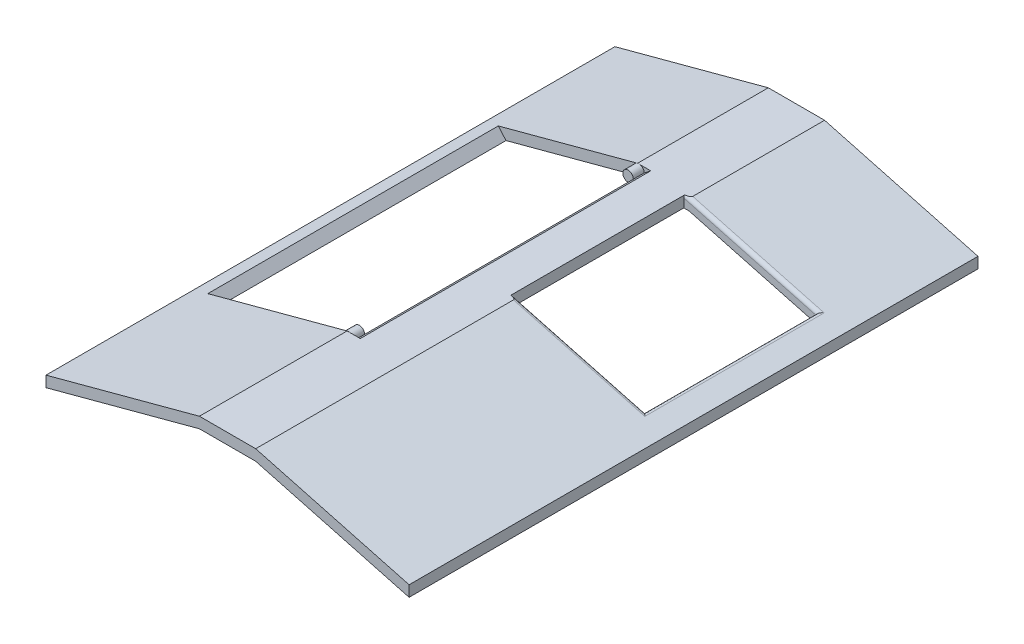
ISO-10303-21;
HEADER;
FILE_DESCRIPTION(('STEP AP214'),'2;1');
FILE_NAME('part.step','',(''),(''),'','','');
FILE_SCHEMA(('AUTOMOTIVE_DESIGN { 1 0 10303 214 1 1 1 1 }'));
ENDSEC;
DATA;
#1=APPLICATION_CONTEXT('core data for automotive mechanical design processes');
#2=APPLICATION_PROTOCOL_DEFINITION('international standard','automotive_design',2000,#1);
#3=PRODUCT_CONTEXT('',#1,'mechanical');
#4=PRODUCT('Part','Part','',(#3));
#5=PRODUCT_RELATED_PRODUCT_CATEGORY('part','',(#4));
#6=PRODUCT_DEFINITION_FORMATION('','',#4);
#7=PRODUCT_DEFINITION_CONTEXT('part definition',#1,'design');
#8=PRODUCT_DEFINITION('design','',#6,#7);
#9=PRODUCT_DEFINITION_SHAPE('','',#8);
#10=(LENGTH_UNIT() NAMED_UNIT(*) SI_UNIT(.MILLI.,.METRE.));
#11=(NAMED_UNIT(*) PLANE_ANGLE_UNIT() SI_UNIT($,.RADIAN.));
#12=(NAMED_UNIT(*) SI_UNIT($,.STERADIAN.) SOLID_ANGLE_UNIT());
#13=UNCERTAINTY_MEASURE_WITH_UNIT(LENGTH_MEASURE(1.E-05),#10,'distance_accuracy_value','');
#14=(GEOMETRIC_REPRESENTATION_CONTEXT(3) GLOBAL_UNCERTAINTY_ASSIGNED_CONTEXT((#13)) GLOBAL_UNIT_ASSIGNED_CONTEXT((#10,
#11,#12)) REPRESENTATION_CONTEXT('',''));
#15=CARTESIAN_POINT('',(0.,0.,0.));
#16=DIRECTION('',(0.,0.,1.));
#17=DIRECTION('',(1.,0.,0.));
#18=AXIS2_PLACEMENT_3D('',#15,#16,#17);
#19=CARTESIAN_POINT('',(145.360476488533,144.220083784299,360.));
#20=DIRECTION('',(0.,0.,-1.));
#21=DIRECTION('',(-1.,0.,0.));
#22=AXIS2_PLACEMENT_3D('',#19,#20,#21);
#23=PLANE('',#22);
#24=CARTESIAN_POINT('',(76.6104764885326,273.434427058062,360.));
#25=DIRECTION('',(0.,0.,-1.));
#26=DIRECTION('',(-1.,0.,0.));
#27=AXIS2_PLACEMENT_3D('',#24,#25,#26);
#28=CIRCLE('',#27,14.4888873943363);
#29=CARTESIAN_POINT('',(80.3604764885326,287.429617586446,360.));
#30=VERTEX_POINT('',#29);
#31=CARTESIAN_POINT('',(91.0993638828689,273.434427058063,360.));
#32=VERTEX_POINT('',#31);
#33=EDGE_CURVE('E240',#30,#32,#28,.T.);
#34=ORIENTED_EDGE('',*,*,#33,.T.);
#35=DIRECTION('',(-0.789637950904653,-0.613573065324009,0.));
#36=VECTOR('',#35,1.);
#37=CARTESIAN_POINT('',(91.0993638828688,273.434427058062,360.));
#38=LINE('',#37,#36);
#39=CARTESIAN_POINT('',(109.110476488533,287.429617586446,360.));
#40=VERTEX_POINT('',#39);
#41=EDGE_CURVE('E228',#40,#32,#38,.T.);
#42=ORIENTED_EDGE('',*,*,#41,.F.);
#43=DIRECTION('',(-1.,0.,0.));
#44=VECTOR('',#43,1.);
#45=CARTESIAN_POINT('',(145.360476488533,287.429617586446,360.));
#46=LINE('',#45,#44);
#47=EDGE_CURVE('E241',#40,#30,#46,.T.);
#48=ORIENTED_EDGE('',*,*,#47,.T.);
#49=EDGE_LOOP('',(#34,#42,#48));
#50=FACE_BOUND('',#49,.T.);
#51=ADVANCED_FACE('F40',(#50),#23,.F.);
#52=CARTESIAN_POINT('',(76.6104764885324,273.434427058063,1227.98180551438));
#53=DIRECTION('',(0.,0.,-1.));
#54=DIRECTION('',(-1.,0.,0.));
#55=AXIS2_PLACEMENT_3D('',#52,#53,#54);
#56=CYLINDRICAL_SURFACE('',#55,14.4888873943364);
#57=CARTESIAN_POINT('',(76.6104764885326,273.434427058062,390.));
#58=DIRECTION('',(0.,0.,-1.));
#59=DIRECTION('',(-1.,0.,0.));
#60=AXIS2_PLACEMENT_3D('',#57,#58,#59);
#61=CIRCLE('',#60,14.4888873943363);
#62=CARTESIAN_POINT('',(91.0993638828688,273.434427058062,390.));
#63=VERTEX_POINT('',#62);
#64=CARTESIAN_POINT('',(84.3561661408643,261.189748632905,390.));
#65=VERTEX_POINT('',#64);
#66=EDGE_CURVE('E63',#63,#65,#61,.T.);
#67=ORIENTED_EDGE('',*,*,#66,.T.);
#68=DIRECTION('',(0.,0.,-1.));
#69=VECTOR('',#68,1.);
#70=CARTESIAN_POINT('',(84.3561661408643,261.189748632905,1227.98180551438));
#71=LINE('',#70,#69);
#72=CARTESIAN_POINT('',(84.3561661408643,261.189748632905,1130.));
#73=VERTEX_POINT('',#72);
#74=EDGE_CURVE('E262',#73,#65,#71,.T.);
#75=ORIENTED_EDGE('',*,*,#74,.F.);
#76=CARTESIAN_POINT('',(76.6104764885326,273.434427058062,1130.));
#77=DIRECTION('',(0.,0.,-1.));
#78=DIRECTION('',(-1.,0.,0.));
#79=AXIS2_PLACEMENT_3D('',#76,#77,#78);
#80=CIRCLE('',#79,14.4888873943363);
#81=CARTESIAN_POINT('',(91.0993638828688,273.434427058062,1130.));
#82=VERTEX_POINT('',#81);
#83=EDGE_CURVE('E447',#82,#73,#80,.T.);
#84=ORIENTED_EDGE('',*,*,#83,.F.);
#85=DIRECTION('',(0.,0.,-1.));
#86=VECTOR('',#85,1.);
#87=CARTESIAN_POINT('',(91.0993638828688,273.434427058062,1227.98180551438));
#88=LINE('',#87,#86);
#89=EDGE_CURVE('E254',#82,#63,#88,.T.);
#90=ORIENTED_EDGE('',*,*,#89,.T.);
#91=EDGE_LOOP('',(#67,#75,#84,#90));
#92=FACE_BOUND('',#91,.T.);
#93=ADVANCED_FACE('F523',(#92),#56,.F.);
#94=CARTESIAN_POINT('',(145.360476488533,144.220083784299,1160.));
#95=DIRECTION('',(0.,0.,1.));
#96=DIRECTION('',(1.,0.,0.));
#97=AXIS2_PLACEMENT_3D('',#94,#95,#96);
#98=PLANE('',#97);
#99=DIRECTION('',(0.,-1.,0.));
#100=VECTOR('',#99,1.);
#101=CARTESIAN_POINT('',(84.3561661408643,257.429617586446,1160.));
#102=LINE('',#101,#100);
#103=CARTESIAN_POINT('',(84.3561661408643,261.189748632905,1160.));
#104=VERTEX_POINT('',#103);
#105=CARTESIAN_POINT('',(84.3561661408643,257.429617586446,1160.));
#106=VERTEX_POINT('',#105);
#107=EDGE_CURVE('E281',#104,#106,#102,.T.);
#108=ORIENTED_EDGE('',*,*,#107,.T.);
#109=DIRECTION('',(-1.,0.,0.));
#110=VECTOR('',#109,1.);
#111=CARTESIAN_POINT('',(145.360476488533,257.429617586446,1160.));
#112=LINE('',#111,#110);
#113=CARTESIAN_POINT('',(72.8604764885326,257.429617586446,1160.));
#114=VERTEX_POINT('',#113);
#115=EDGE_CURVE('E554',#106,#114,#112,.T.);
#116=ORIENTED_EDGE('',*,*,#115,.T.);
#117=DIRECTION('',(-0.96592582628907,-0.258819045102515,0.));
#118=VECTOR('',#117,1.);
#119=CARTESIAN_POINT('',(112.201513925183,267.971016796998,1160.));
#120=LINE('',#119,#118);
#121=CARTESIAN_POINT('',(-289.479523511467,160.340907200955,1160.));
#122=VERTEX_POINT('',#121);
#123=EDGE_CURVE('E552',#114,#122,#120,.T.);
#124=ORIENTED_EDGE('',*,*,#123,.T.);
#125=DIRECTION('',(0.658199923847991,-0.752843184366106,0.));
#126=VECTOR('',#125,1.);
#127=CARTESIAN_POINT('',(-93.1068222554388,-64.2684316635463,1160.));
#128=LINE('',#127,#126);
#129=CARTESIAN_POINT('',(-310.729891689827,184.6468882087,1160.));
#130=VERTEX_POINT('',#129);
#131=EDGE_CURVE('E412',#122,#130,#128,.F.);
#132=ORIENTED_EDGE('',*,*,#131,.T.);
#133=DIRECTION('',(0.96592582628907,0.258819045102515,0.));
#134=VECTOR('',#133,1.);
#135=CARTESIAN_POINT('',(104.701513925183,295.961397853765,1160.));
#136=LINE('',#135,#134);
#137=CARTESIAN_POINT('',(72.8604764885326,287.429617586446,1160.));
#138=VERTEX_POINT('',#137);
#139=EDGE_CURVE('E545',#130,#138,#136,.T.);
#140=ORIENTED_EDGE('',*,*,#139,.T.);
#141=CARTESIAN_POINT('',(76.6104764885326,273.434427058062,1160.));
#142=DIRECTION('',(0.,0.,1.));
#143=DIRECTION('',(1.,0.,0.));
#144=AXIS2_PLACEMENT_3D('',#141,#142,#143);
#145=CIRCLE('',#144,14.4888873943363);
#146=EDGE_CURVE('E48',#104,#138,#145,.F.);
#147=ORIENTED_EDGE('',*,*,#146,.F.);
#148=EDGE_LOOP('',(#108,#116,#124,#132,#140,#147));
#149=FACE_BOUND('',#148,.T.);
#150=ADVANCED_FACE('F529',(#149),#98,.F.);
#151=DIRECTION('',(-0.789637950904653,-0.613573065324009,0.));
#152=VECTOR('',#151,1.);
#153=CARTESIAN_POINT('',(91.0993638828688,273.434427058062,1160.));
#154=LINE('',#153,#152);
#155=CARTESIAN_POINT('',(109.110476488533,287.429617586446,1160.));
#156=VERTEX_POINT('',#155);
#157=CARTESIAN_POINT('',(91.0993638828688,273.434427058062,1160.));
#158=VERTEX_POINT('',#157);
#159=EDGE_CURVE('E237',#156,#158,#154,.T.);
#160=ORIENTED_EDGE('',*,*,#159,.T.);
#161=CARTESIAN_POINT('',(80.3604764885326,287.429617586446,1160.));
#162=VERTEX_POINT('',#161);
#163=EDGE_CURVE('E11',#162,#158,#145,.F.);
#164=ORIENTED_EDGE('',*,*,#163,.F.);
#165=DIRECTION('',(1.,0.,0.));
#166=VECTOR('',#165,1.);
#167=CARTESIAN_POINT('',(145.360476488533,287.429617586446,1160.));
#168=LINE('',#167,#166);
#169=EDGE_CURVE('E294',#162,#156,#168,.T.);
#170=ORIENTED_EDGE('',*,*,#169,.T.);
#171=EDGE_LOOP('',(#160,#164,#170));
#172=FACE_BOUND('',#171,.T.);
#173=ADVANCED_FACE('F292',(#172),#98,.F.);
#174=CARTESIAN_POINT('',(84.3561661408643,261.189748632905,360.));
#175=VERTEX_POINT('',#174);
#176=CARTESIAN_POINT('',(72.8604764885325,287.429617586446,360.));
#177=VERTEX_POINT('',#176);
#178=EDGE_CURVE('E246',#175,#177,#28,.T.);
#179=ORIENTED_EDGE('',*,*,#178,.T.);
#180=DIRECTION('',(-0.96592582628907,-0.258819045102515,0.));
#181=VECTOR('',#180,1.);
#182=CARTESIAN_POINT('',(104.701513925183,295.961397853765,360.));
#183=LINE('',#182,#181);
#184=CARTESIAN_POINT('',(-310.729891689827,184.6468882087,360.));
#185=VERTEX_POINT('',#184);
#186=EDGE_CURVE('E345',#177,#185,#183,.T.);
#187=ORIENTED_EDGE('',*,*,#186,.T.);
#188=DIRECTION('',(-0.658199923847991,0.752843184366106,0.));
#189=VECTOR('',#188,1.);
#190=CARTESIAN_POINT('',(-93.1068222554389,-64.2684316635463,360.));
#191=LINE('',#190,#189);
#192=CARTESIAN_POINT('',(-289.479523511467,160.340907200955,360.));
#193=VERTEX_POINT('',#192);
#194=EDGE_CURVE('E415',#185,#193,#191,.F.);
#195=ORIENTED_EDGE('',*,*,#194,.T.);
#196=DIRECTION('',(0.96592582628907,0.258819045102515,0.));
#197=VECTOR('',#196,1.);
#198=CARTESIAN_POINT('',(112.201513925183,267.971016796998,360.));
#199=LINE('',#198,#197);
#200=CARTESIAN_POINT('',(72.8604764885326,257.429617586446,360.));
#201=VERTEX_POINT('',#200);
#202=EDGE_CURVE('E306',#193,#201,#199,.T.);
#203=ORIENTED_EDGE('',*,*,#202,.T.);
#204=DIRECTION('',(1.,0.,0.));
#205=VECTOR('',#204,1.);
#206=CARTESIAN_POINT('',(145.360476488533,257.429617586446,360.));
#207=LINE('',#206,#205);
#208=CARTESIAN_POINT('',(84.3561661408643,257.429617586446,360.));
#209=VERTEX_POINT('',#208);
#210=EDGE_CURVE('E308',#201,#209,#207,.T.);
#211=ORIENTED_EDGE('',*,*,#210,.T.);
#212=DIRECTION('',(0.,-1.,0.));
#213=VECTOR('',#212,1.);
#214=CARTESIAN_POINT('',(84.3561661408643,257.429617586446,360.));
#215=LINE('',#214,#213);
#216=EDGE_CURVE('E269',#175,#209,#215,.T.);
#217=ORIENTED_EDGE('',*,*,#216,.F.);
#218=EDGE_LOOP('',(#179,#187,#195,#203,#211,#217));
#219=FACE_BOUND('',#218,.T.);
#220=ADVANCED_FACE('F525',(#219),#23,.F.);
#221=CARTESIAN_POINT('',(76.6104764885326,273.434427058062,1130.));
#222=DIRECTION('',(0.,0.,1.));
#223=DIRECTION('',(1.,0.,0.));
#224=AXIS2_PLACEMENT_3D('',#221,#222,#223);
#225=CYLINDRICAL_SURFACE('',#224,14.4888873943363);
#226=EDGE_CURVE('E266',#104,#73,#71,.T.);
#227=ORIENTED_EDGE('',*,*,#226,.F.);
#228=ORIENTED_EDGE('',*,*,#146,.T.);
#229=CARTESIAN_POINT('',(76.6104764885326,273.434427058062,1160.));
#230=DIRECTION('',(0.,0.,-1.));
#231=DIRECTION('',(-1.,0.,0.));
#232=AXIS2_PLACEMENT_3D('',#229,#230,#231);
#233=CIRCLE('',#232,14.4888873943363);
#234=EDGE_CURVE('E283',#138,#162,#233,.T.);
#235=ORIENTED_EDGE('',*,*,#234,.T.);
#236=ORIENTED_EDGE('',*,*,#163,.T.);
#237=EDGE_CURVE('E256',#158,#82,#88,.T.);
#238=ORIENTED_EDGE('',*,*,#237,.T.);
#239=EDGE_CURVE('E287',#73,#82,#80,.T.);
#240=ORIENTED_EDGE('',*,*,#239,.F.);
#241=EDGE_LOOP('',(#227,#228,#235,#236,#238,#240));
#242=FACE_BOUND('',#241,.T.);
#243=ADVANCED_FACE('F296',(#242),#225,.T.);
#244=CARTESIAN_POINT('',(227.860476488533,257.429617586446,1566.7));
#245=DIRECTION('',(0.,1.,0.));
#246=DIRECTION('',(0.,0.,1.));
#247=AXIS2_PLACEMENT_3D('',#244,#245,#246);
#248=PLANE('',#247);
#249=ORIENTED_EDGE('',*,*,#115,.F.);
#250=DIRECTION('',(0.,0.,-1.));
#251=VECTOR('',#250,1.);
#252=CARTESIAN_POINT('',(84.3561661408643,257.429617586446,1227.98180551438));
#253=LINE('',#252,#251);
#254=EDGE_CURVE('E273',#106,#209,#253,.T.);
#255=ORIENTED_EDGE('',*,*,#254,.T.);
#256=ORIENTED_EDGE('',*,*,#210,.F.);
#257=DIRECTION('',(0.,0.,-1.));
#258=VECTOR('',#257,1.);
#259=CARTESIAN_POINT('',(72.8604764885326,257.429617586446,1566.7));
#260=LINE('',#259,#258);
#261=CARTESIAN_POINT('',(72.8604764885326,257.429617586446,0.));
#262=VERTEX_POINT('',#261);
#263=EDGE_CURVE('E364',#201,#262,#260,.T.);
#264=ORIENTED_EDGE('',*,*,#263,.T.);
#265=DIRECTION('',(1.,0.,0.));
#266=VECTOR('',#265,1.);
#267=CARTESIAN_POINT('',(227.860476488533,257.429617586446,0.));
#268=LINE('',#267,#266);
#269=CARTESIAN_POINT('',(227.860476488533,257.429617586446,0.));
#270=VERTEX_POINT('',#269);
#271=EDGE_CURVE('E314',#262,#270,#268,.T.);
#272=ORIENTED_EDGE('',*,*,#271,.T.);
#273=DIRECTION('',(0.,0.,-1.));
#274=VECTOR('',#273,1.);
#275=CARTESIAN_POINT('',(227.860476488533,257.429617586446,1566.7));
#276=LINE('',#275,#274);
#277=CARTESIAN_POINT('',(227.860476488533,257.429617586446,373.));
#278=VERTEX_POINT('',#277);
#279=EDGE_CURVE('E405',#278,#270,#276,.T.);
#280=ORIENTED_EDGE('',*,*,#279,.F.);
#281=DIRECTION('',(1.,0.,0.));
#282=VECTOR('',#281,1.);
#283=CARTESIAN_POINT('',(213.100476488532,257.429617586446,373.));
#284=LINE('',#283,#282);
#285=CARTESIAN_POINT('',(213.100476488532,257.429617586446,373.));
#286=VERTEX_POINT('',#285);
#287=EDGE_CURVE('E324',#286,#278,#284,.T.);
#288=ORIENTED_EDGE('',*,*,#287,.F.);
#289=DIRECTION('',(0.,0.,-1.));
#290=VECTOR('',#289,1.);
#291=CARTESIAN_POINT('',(213.100476488532,257.429617586446,373.));
#292=LINE('',#291,#290);
#293=CARTESIAN_POINT('',(213.100476488532,257.429617586446,847.));
#294=VERTEX_POINT('',#293);
#295=EDGE_CURVE('E321',#294,#286,#292,.T.);
#296=ORIENTED_EDGE('',*,*,#295,.F.);
#297=DIRECTION('',(-1.,0.,0.));
#298=VECTOR('',#297,1.);
#299=CARTESIAN_POINT('',(213.100476488532,257.429617586446,847.));
#300=LINE('',#299,#298);
#301=CARTESIAN_POINT('',(227.860476488533,257.429617586446,847.));
#302=VERTEX_POINT('',#301);
#303=EDGE_CURVE('E342',#302,#294,#300,.T.);
#304=ORIENTED_EDGE('',*,*,#303,.F.);
#305=CARTESIAN_POINT('',(227.860476488533,257.429617586446,1566.7));
#306=VERTEX_POINT('',#305);
#307=EDGE_CURVE('E406',#306,#302,#276,.T.);
#308=ORIENTED_EDGE('',*,*,#307,.F.);
#309=DIRECTION('',(1.,0.,0.));
#310=VECTOR('',#309,1.);
#311=CARTESIAN_POINT('',(227.860476488533,257.429617586446,1566.7));
#312=LINE('',#311,#310);
#313=CARTESIAN_POINT('',(72.8604764885326,257.429617586446,1566.7));
#314=VERTEX_POINT('',#313);
#315=EDGE_CURVE('E346',#314,#306,#312,.T.);
#316=ORIENTED_EDGE('',*,*,#315,.F.);
#317=EDGE_CURVE('E383',#314,#114,#260,.T.);
#318=ORIENTED_EDGE('',*,*,#317,.T.);
#319=EDGE_LOOP('',(#249,#255,#256,#264,#272,#280,#288,#296,#304,#308,#316,#318));
#320=FACE_BOUND('',#319,.T.);
#321=ADVANCED_FACE('F505',(#320),#248,.F.);
#322=CARTESIAN_POINT('',(650.360476488533,144.221083784299,1566.7));
#323=DIRECTION('',(0.258819045102514,0.96592582628907,0.));
#324=DIRECTION('',(-0.96592582628907,0.258819045102514,0.));
#325=AXIS2_PLACEMENT_3D('',#322,#323,#324);
#326=PLANE('',#325);
#327=DIRECTION('',(0.,0.,1.));
#328=VECTOR('',#327,1.);
#329=CARTESIAN_POINT('',(577.120476488533,163.845682637954,373.));
#330=LINE('',#329,#328);
#331=CARTESIAN_POINT('',(577.120476488533,163.845682637954,373.));
#332=VERTEX_POINT('',#331);
#333=CARTESIAN_POINT('',(577.120476488533,163.845682637954,847.));
#334=VERTEX_POINT('',#333);
#335=EDGE_CURVE('E315',#332,#334,#330,.T.);
#336=ORIENTED_EDGE('',*,*,#335,.F.);
#337=DIRECTION('',(0.96592582628907,-0.258819045102514,0.));
#338=VECTOR('',#337,1.);
#339=CARTESIAN_POINT('',(242.391592459139,253.536016796999,373.));
#340=LINE('',#339,#338);
#341=EDGE_CURVE('E317',#278,#332,#340,.T.);
#342=ORIENTED_EDGE('',*,*,#341,.F.);
#343=ORIENTED_EDGE('',*,*,#279,.T.);
#344=DIRECTION('',(0.96592582628907,-0.258819045102514,0.));
#345=VECTOR('',#344,1.);
#346=CARTESIAN_POINT('',(650.360476488533,144.221083784299,0.));
#347=LINE('',#346,#345);
#348=CARTESIAN_POINT('',(650.360476488533,144.221083784299,0.));
#349=VERTEX_POINT('',#348);
#350=EDGE_CURVE('E367',#270,#349,#347,.T.);
#351=ORIENTED_EDGE('',*,*,#350,.T.);
#352=DIRECTION('',(0.,0.,-1.));
#353=VECTOR('',#352,1.);
#354=CARTESIAN_POINT('',(650.360476488533,144.221083784299,1566.7));
#355=LINE('',#354,#353);
#356=CARTESIAN_POINT('',(650.360476488533,144.221083784299,1566.7));
#357=VERTEX_POINT('',#356);
#358=EDGE_CURVE('E402',#357,#349,#355,.T.);
#359=ORIENTED_EDGE('',*,*,#358,.F.);
#360=DIRECTION('',(0.96592582628907,-0.258819045102514,0.));
#361=VECTOR('',#360,1.);
#362=CARTESIAN_POINT('',(650.360476488533,144.221083784299,1566.7));
#363=LINE('',#362,#361);
#364=EDGE_CURVE('E349',#306,#357,#363,.T.);
#365=ORIENTED_EDGE('',*,*,#364,.F.);
#366=ORIENTED_EDGE('',*,*,#307,.T.);
#367=DIRECTION('',(-0.96592582628907,0.258819045102514,0.));
#368=VECTOR('',#367,1.);
#369=CARTESIAN_POINT('',(242.391592459139,253.536016796999,847.));
#370=LINE('',#369,#368);
#371=EDGE_CURVE('E332',#334,#302,#370,.T.);
#372=ORIENTED_EDGE('',*,*,#371,.F.);
#373=EDGE_LOOP('',(#336,#342,#343,#351,#359,#365,#366,#372));
#374=FACE_BOUND('',#373,.T.);
#375=ADVANCED_FACE('F501',(#374),#326,.F.);
#376=CARTESIAN_POINT('',(650.360476488533,174.221083784299,1566.7));
#377=DIRECTION('',(-1.,0.,0.));
#378=DIRECTION('',(0.,0.,1.));
#379=AXIS2_PLACEMENT_3D('',#376,#377,#378);
#380=PLANE('',#379);
#381=DIRECTION('',(0.,1.,0.));
#382=VECTOR('',#381,1.);
#383=CARTESIAN_POINT('',(650.360476488533,174.221083784299,0.));
#384=LINE('',#383,#382);
#385=CARTESIAN_POINT('',(650.360476488533,174.221083784299,0.));
#386=VERTEX_POINT('',#385);
#387=EDGE_CURVE('E369',#349,#386,#384,.T.);
#388=ORIENTED_EDGE('',*,*,#387,.T.);
#389=DIRECTION('',(0.,0.,-1.));
#390=VECTOR('',#389,1.);
#391=CARTESIAN_POINT('',(650.360476488533,174.221083784299,1566.7));
#392=LINE('',#391,#390);
#393=CARTESIAN_POINT('',(650.360476488533,174.221083784299,1566.7));
#394=VERTEX_POINT('',#393);
#395=EDGE_CURVE('E399',#394,#386,#392,.T.);
#396=ORIENTED_EDGE('',*,*,#395,.F.);
#397=DIRECTION('',(0.,1.,0.));
#398=VECTOR('',#397,1.);
#399=CARTESIAN_POINT('',(650.360476488533,174.221083784299,1566.7));
#400=LINE('',#399,#398);
#401=EDGE_CURVE('E352',#357,#394,#400,.T.);
#402=ORIENTED_EDGE('',*,*,#401,.F.);
#403=ORIENTED_EDGE('',*,*,#358,.T.);
#404=EDGE_LOOP('',(#388,#396,#402,#403));
#405=FACE_BOUND('',#404,.T.);
#406=ADVANCED_FACE('F513',(#405),#380,.F.);
#407=CARTESIAN_POINT('',(227.860476488532,287.429617586446,1566.7));
#408=DIRECTION('',(-0.258819045102515,-0.96592582628907,0.));
#409=DIRECTION('',(0.96592582628907,-0.258819045102515,0.));
#410=AXIS2_PLACEMENT_3D('',#407,#408,#409);
#411=PLANE('',#410);
#412=DIRECTION('',(0.,0.,-1.));
#413=VECTOR('',#412,1.);
#414=CARTESIAN_POINT('',(227.860476488532,287.429617586446,1566.7));
#415=LINE('',#414,#413);
#416=CARTESIAN_POINT('',(227.860476488532,287.429617586446,363.));
#417=VERTEX_POINT('',#416);
#418=CARTESIAN_POINT('',(227.860476488532,287.429617586446,0.));
#419=VERTEX_POINT('',#418);
#420=EDGE_CURVE('E395',#417,#419,#415,.T.);
#421=ORIENTED_EDGE('',*,*,#420,.F.);
#422=DIRECTION('',(-0.96592582628907,0.258819045102515,0.));
#423=VECTOR('',#422,1.);
#424=CARTESIAN_POINT('',(227.860476488532,287.429617586446,363.));
#425=LINE('',#424,#423);
#426=CARTESIAN_POINT('',(589.708666939558,190.472687172433,363.));
#427=VERTEX_POINT('',#426);
#428=EDGE_CURVE('E429',#417,#427,#425,.F.);
#429=ORIENTED_EDGE('',*,*,#428,.T.);
#430=DIRECTION('',(0.,0.,-1.));
#431=VECTOR('',#430,1.);
#432=CARTESIAN_POINT('',(589.708666939558,190.472687172433,1566.7));
#433=LINE('',#432,#431);
#434=CARTESIAN_POINT('',(589.708666939558,190.472687172433,857.));
#435=VERTEX_POINT('',#434);
#436=EDGE_CURVE('E427',#427,#435,#433,.F.);
#437=ORIENTED_EDGE('',*,*,#436,.T.);
#438=DIRECTION('',(0.96592582628907,-0.258819045102515,0.));
#439=VECTOR('',#438,1.);
#440=CARTESIAN_POINT('',(227.860476488532,287.429617586446,857.));
#441=LINE('',#440,#439);
#442=CARTESIAN_POINT('',(227.860476488532,287.429617586446,857.));
#443=VERTEX_POINT('',#442);
#444=EDGE_CURVE('E425',#435,#443,#441,.F.);
#445=ORIENTED_EDGE('',*,*,#444,.T.);
#446=CARTESIAN_POINT('',(227.860476488532,287.429617586446,1566.7));
#447=VERTEX_POINT('',#446);
#448=EDGE_CURVE('E396',#447,#443,#415,.T.);
#449=ORIENTED_EDGE('',*,*,#448,.F.);
#450=DIRECTION('',(-0.96592582628907,0.258819045102515,0.));
#451=VECTOR('',#450,1.);
#452=CARTESIAN_POINT('',(227.860476488532,287.429617586446,1566.7));
#453=LINE('',#452,#451);
#454=EDGE_CURVE('E354',#394,#447,#453,.T.);
#455=ORIENTED_EDGE('',*,*,#454,.F.);
#456=ORIENTED_EDGE('',*,*,#395,.T.);
#457=DIRECTION('',(-0.96592582628907,0.258819045102515,0.));
#458=VECTOR('',#457,1.);
#459=CARTESIAN_POINT('',(227.860476488532,287.429617586446,0.));
#460=LINE('',#459,#458);
#461=EDGE_CURVE('E371',#386,#419,#460,.T.);
#462=ORIENTED_EDGE('',*,*,#461,.T.);
#463=EDGE_LOOP('',(#421,#429,#437,#445,#449,#455,#456,#462));
#464=FACE_BOUND('',#463,.T.);
#465=ADVANCED_FACE('F464',(#464),#411,.F.);
#466=CARTESIAN_POINT('',(72.8604764885325,287.429617586446,1566.7));
#467=DIRECTION('',(0.,-1.,0.));
#468=DIRECTION('',(0.,0.,-1.));
#469=AXIS2_PLACEMENT_3D('',#466,#467,#468);
#470=PLANE('',#469);
#471=DIRECTION('',(0.,0.,-1.));
#472=VECTOR('',#471,1.);
#473=CARTESIAN_POINT('',(109.110476488533,287.429617586446,1227.98180551438));
#474=LINE('',#473,#472);
#475=EDGE_CURVE('E235',#156,#40,#474,.T.);
#476=ORIENTED_EDGE('',*,*,#475,.F.);
#477=ORIENTED_EDGE('',*,*,#169,.F.);
#478=EDGE_CURVE('E303',#138,#162,#168,.T.);
#479=ORIENTED_EDGE('',*,*,#478,.F.);
#480=DIRECTION('',(0.,0.,-1.));
#481=VECTOR('',#480,1.);
#482=CARTESIAN_POINT('',(72.8604764885325,287.429617586446,1566.7));
#483=LINE('',#482,#481);
#484=CARTESIAN_POINT('',(72.8604764885325,287.429617586446,1566.7));
#485=VERTEX_POINT('',#484);
#486=EDGE_CURVE('E393',#485,#138,#483,.T.);
#487=ORIENTED_EDGE('',*,*,#486,.F.);
#488=DIRECTION('',(-1.,0.,0.));
#489=VECTOR('',#488,1.);
#490=CARTESIAN_POINT('',(72.8604764885325,287.429617586446,1566.7));
#491=LINE('',#490,#489);
#492=EDGE_CURVE('E356',#447,#485,#491,.T.);
#493=ORIENTED_EDGE('',*,*,#492,.F.);
#494=ORIENTED_EDGE('',*,*,#448,.T.);
#495=CARTESIAN_POINT('',(189.223443436968,287.429617586446,857.));
#496=DIRECTION('',(0.,-1.,0.));
#497=DIRECTION('',(1.,0.,0.));
#498=AXIS2_PLACEMENT_3D('',#495,#496,#497);
#499=ELLIPSE('',#498,38.6370330515636,10.);
#500=CARTESIAN_POINT('',(213.100476488532,287.429617586446,849.138086103371));
#501=VERTEX_POINT('',#500);
#502=EDGE_CURVE('E420',#443,#501,#499,.F.);
#503=ORIENTED_EDGE('',*,*,#502,.T.);
#504=DIRECTION('',(0.,0.,1.));
#505=VECTOR('',#504,1.);
#506=CARTESIAN_POINT('',(213.100476488532,287.429617586446,373.));
#507=LINE('',#506,#505);
#508=CARTESIAN_POINT('',(213.100476488532,287.429617586446,370.861913896629));
#509=VERTEX_POINT('',#508);
#510=EDGE_CURVE('E326',#509,#501,#507,.T.);
#511=ORIENTED_EDGE('',*,*,#510,.F.);
#512=CARTESIAN_POINT('',(189.223443436968,287.429617586446,363.));
#513=DIRECTION('',(0.,-1.,0.));
#514=DIRECTION('',(-1.,0.,0.));
#515=AXIS2_PLACEMENT_3D('',#512,#513,#514);
#516=ELLIPSE('',#515,38.6370330515636,10.);
#517=EDGE_CURVE('E423',#509,#417,#516,.F.);
#518=ORIENTED_EDGE('',*,*,#517,.T.);
#519=ORIENTED_EDGE('',*,*,#420,.T.);
#520=DIRECTION('',(-1.,0.,0.));
#521=VECTOR('',#520,1.);
#522=CARTESIAN_POINT('',(72.8604764885325,287.429617586446,0.));
#523=LINE('',#522,#521);
#524=CARTESIAN_POINT('',(72.8604764885325,287.429617586446,0.));
#525=VERTEX_POINT('',#524);
#526=EDGE_CURVE('E374',#419,#525,#523,.T.);
#527=ORIENTED_EDGE('',*,*,#526,.T.);
#528=EDGE_CURVE('E392',#177,#525,#483,.T.);
#529=ORIENTED_EDGE('',*,*,#528,.F.);
#530=DIRECTION('',(1.,0.,0.));
#531=VECTOR('',#530,1.);
#532=CARTESIAN_POINT('',(72.8604764885331,287.429617586446,360.));
#533=LINE('',#532,#531);
#534=EDGE_CURVE('E55',#177,#30,#533,.T.);
#535=ORIENTED_EDGE('',*,*,#534,.T.);
#536=ORIENTED_EDGE('',*,*,#47,.F.);
#537=EDGE_LOOP('',(#476,#477,#479,#487,#493,#494,#503,#511,#518,#519,#527,#529,#535,#536));
#538=FACE_BOUND('',#537,.T.);
#539=ADVANCED_FACE('F467',(#538),#470,.F.);
#540=CARTESIAN_POINT('',(-349.639523511467,174.2210837843,1566.7));
#541=DIRECTION('',(0.258819045102515,-0.96592582628907,0.));
#542=DIRECTION('',(0.96592582628907,0.258819045102515,0.));
#543=AXIS2_PLACEMENT_3D('',#540,#541,#542);
#544=PLANE('',#543);
#545=ORIENTED_EDGE('',*,*,#139,.F.);
#546=DIRECTION('',(0.,0.,-1.));
#547=VECTOR('',#546,1.);
#548=CARTESIAN_POINT('',(-310.729891689827,184.6468882087,1566.7));
#549=LINE('',#548,#547);
#550=EDGE_CURVE('E409',#130,#185,#549,.T.);
#551=ORIENTED_EDGE('',*,*,#550,.T.);
#552=ORIENTED_EDGE('',*,*,#186,.F.);
#553=ORIENTED_EDGE('',*,*,#528,.T.);
#554=DIRECTION('',(-0.96592582628907,-0.258819045102515,0.));
#555=VECTOR('',#554,1.);
#556=CARTESIAN_POINT('',(-349.639523511467,174.2210837843,0.));
#557=LINE('',#556,#555);
#558=CARTESIAN_POINT('',(-349.639523511467,174.2210837843,0.));
#559=VERTEX_POINT('',#558);
#560=EDGE_CURVE('E377',#525,#559,#557,.T.);
#561=ORIENTED_EDGE('',*,*,#560,.T.);
#562=DIRECTION('',(0.,0.,-1.));
#563=VECTOR('',#562,1.);
#564=CARTESIAN_POINT('',(-349.639523511467,174.2210837843,1566.7));
#565=LINE('',#564,#563);
#566=CARTESIAN_POINT('',(-349.639523511467,174.2210837843,1566.7));
#567=VERTEX_POINT('',#566);
#568=EDGE_CURVE('E389',#567,#559,#565,.T.);
#569=ORIENTED_EDGE('',*,*,#568,.F.);
#570=DIRECTION('',(-0.96592582628907,-0.258819045102515,0.));
#571=VECTOR('',#570,1.);
#572=CARTESIAN_POINT('',(-349.639523511467,174.2210837843,1566.7));
#573=LINE('',#572,#571);
#574=EDGE_CURVE('E358',#485,#567,#573,.T.);
#575=ORIENTED_EDGE('',*,*,#574,.F.);
#576=ORIENTED_EDGE('',*,*,#486,.T.);
#577=EDGE_LOOP('',(#545,#551,#552,#553,#561,#569,#575,#576));
#578=FACE_BOUND('',#577,.T.);
#579=ADVANCED_FACE('F542',(#578),#544,.F.);
#580=CARTESIAN_POINT('',(-349.639523511467,144.221083784299,1566.7));
#581=DIRECTION('',(1.,0.,0.));
#582=DIRECTION('',(0.,0.,-1.));
#583=AXIS2_PLACEMENT_3D('',#580,#581,#582);
#584=PLANE('',#583);
#585=DIRECTION('',(0.,-1.,0.));
#586=VECTOR('',#585,1.);
#587=CARTESIAN_POINT('',(-349.639523511467,144.221083784299,0.));
#588=LINE('',#587,#586);
#589=CARTESIAN_POINT('',(-349.639523511467,144.221083784299,0.));
#590=VERTEX_POINT('',#589);
#591=EDGE_CURVE('E379',#559,#590,#588,.T.);
#592=ORIENTED_EDGE('',*,*,#591,.T.);
#593=DIRECTION('',(0.,0.,-1.));
#594=VECTOR('',#593,1.);
#595=CARTESIAN_POINT('',(-349.639523511467,144.221083784299,1566.7));
#596=LINE('',#595,#594);
#597=CARTESIAN_POINT('',(-349.639523511467,144.221083784299,1566.7));
#598=VERTEX_POINT('',#597);
#599=EDGE_CURVE('E386',#598,#590,#596,.T.);
#600=ORIENTED_EDGE('',*,*,#599,.F.);
#601=DIRECTION('',(0.,-1.,0.));
#602=VECTOR('',#601,1.);
#603=CARTESIAN_POINT('',(-349.639523511467,144.221083784299,1566.7));
#604=LINE('',#603,#602);
#605=EDGE_CURVE('E360',#567,#598,#604,.T.);
#606=ORIENTED_EDGE('',*,*,#605,.F.);
#607=ORIENTED_EDGE('',*,*,#568,.T.);
#608=EDGE_LOOP('',(#592,#600,#606,#607));
#609=FACE_BOUND('',#608,.T.);
#610=ADVANCED_FACE('F567',(#609),#584,.F.);
#611=CARTESIAN_POINT('',(72.8604764885326,257.429617586446,1566.7));
#612=DIRECTION('',(-0.258819045102514,0.96592582628907,0.));
#613=DIRECTION('',(-0.96592582628907,-0.258819045102515,0.));
#614=AXIS2_PLACEMENT_3D('',#611,#612,#613);
#615=PLANE('',#614);
#616=DIRECTION('',(0.,0.,-1.));
#617=VECTOR('',#616,1.);
#618=CARTESIAN_POINT('',(-289.479523511467,160.340907200955,360.));
#619=LINE('',#618,#617);
#620=EDGE_CURVE('E547',#122,#193,#619,.T.);
#621=ORIENTED_EDGE('',*,*,#620,.F.);
#622=ORIENTED_EDGE('',*,*,#123,.F.);
#623=ORIENTED_EDGE('',*,*,#317,.F.);
#624=DIRECTION('',(0.96592582628907,0.258819045102515,0.));
#625=VECTOR('',#624,1.);
#626=CARTESIAN_POINT('',(72.8604764885326,257.429617586446,1566.7));
#627=LINE('',#626,#625);
#628=EDGE_CURVE('E362',#598,#314,#627,.T.);
#629=ORIENTED_EDGE('',*,*,#628,.F.);
#630=ORIENTED_EDGE('',*,*,#599,.T.);
#631=DIRECTION('',(0.96592582628907,0.258819045102515,0.));
#632=VECTOR('',#631,1.);
#633=CARTESIAN_POINT('',(72.8604764885326,257.429617586446,0.));
#634=LINE('',#633,#632);
#635=EDGE_CURVE('E350',#590,#262,#634,.T.);
#636=ORIENTED_EDGE('',*,*,#635,.T.);
#637=ORIENTED_EDGE('',*,*,#263,.F.);
#638=ORIENTED_EDGE('',*,*,#202,.F.);
#639=EDGE_LOOP('',(#621,#622,#623,#629,#630,#636,#637,#638));
#640=FACE_BOUND('',#639,.T.);
#641=ADVANCED_FACE('F559',(#640),#615,.F.);
#642=CARTESIAN_POINT('',(0.,0.,1566.7));
#643=DIRECTION('',(0.,0.,-1.));
#644=DIRECTION('',(-1.,0.,0.));
#645=AXIS2_PLACEMENT_3D('',#642,#643,#644);
#646=PLANE('',#645);
#647=ORIENTED_EDGE('',*,*,#315,.T.);
#648=ORIENTED_EDGE('',*,*,#364,.T.);
#649=ORIENTED_EDGE('',*,*,#401,.T.);
#650=ORIENTED_EDGE('',*,*,#454,.T.);
#651=ORIENTED_EDGE('',*,*,#492,.T.);
#652=ORIENTED_EDGE('',*,*,#574,.T.);
#653=ORIENTED_EDGE('',*,*,#605,.T.);
#654=ORIENTED_EDGE('',*,*,#628,.T.);
#655=EDGE_LOOP('',(#647,#648,#649,#650,#651,#652,#653,#654));
#656=FACE_BOUND('',#655,.T.);
#657=ADVANCED_FACE('F470',(#656),#646,.F.);
#658=CARTESIAN_POINT('',(0.,0.,0.));
#659=DIRECTION('',(0.,0.,-1.));
#660=DIRECTION('',(-1.,0.,0.));
#661=AXIS2_PLACEMENT_3D('',#658,#659,#660);
#662=PLANE('',#661);
#663=ORIENTED_EDGE('',*,*,#271,.F.);
#664=ORIENTED_EDGE('',*,*,#635,.F.);
#665=ORIENTED_EDGE('',*,*,#591,.F.);
#666=ORIENTED_EDGE('',*,*,#560,.F.);
#667=ORIENTED_EDGE('',*,*,#526,.F.);
#668=ORIENTED_EDGE('',*,*,#461,.F.);
#669=ORIENTED_EDGE('',*,*,#387,.F.);
#670=ORIENTED_EDGE('',*,*,#350,.F.);
#671=EDGE_LOOP('',(#663,#664,#665,#666,#667,#668,#669,#670));
#672=FACE_BOUND('',#671,.T.);
#673=ADVANCED_FACE('F480',(#672),#662,.T.);
#674=CARTESIAN_POINT('',(213.100476488532,144.220083784299,373.));
#675=DIRECTION('',(-1.,0.,0.));
#676=DIRECTION('',(0.,0.,1.));
#677=AXIS2_PLACEMENT_3D('',#674,#675,#676);
#678=PLANE('',#677);
#679=ORIENTED_EDGE('',*,*,#295,.T.);
#680=DIRECTION('',(0.,1.,0.));
#681=VECTOR('',#680,1.);
#682=CARTESIAN_POINT('',(213.100476488532,144.220083784299,373.));
#683=LINE('',#682,#681);
#684=CARTESIAN_POINT('',(213.100476488532,281.031785862628,373.));
#685=VERTEX_POINT('',#684);
#686=EDGE_CURVE('E329',#286,#685,#683,.T.);
#687=ORIENTED_EDGE('',*,*,#686,.T.);
#688=CARTESIAN_POINT('',(213.100476488532,281.031785862628,363.));
#689=DIRECTION('',(-1.,0.,0.));
#690=DIRECTION('',(0.,1.,0.));
#691=AXIS2_PLACEMENT_3D('',#688,#689,#690);
#692=ELLIPSE('',#691,10.3527618041008,10.);
#693=EDGE_CURVE('E435',#685,#509,#692,.T.);
#694=ORIENTED_EDGE('',*,*,#693,.T.);
#695=ORIENTED_EDGE('',*,*,#510,.T.);
#696=CARTESIAN_POINT('',(213.100476488532,281.031785862628,857.));
#697=DIRECTION('',(-1.,0.,0.));
#698=DIRECTION('',(0.,-1.,0.));
#699=AXIS2_PLACEMENT_3D('',#696,#697,#698);
#700=ELLIPSE('',#699,10.3527618041008,10.);
#701=CARTESIAN_POINT('',(213.100476488532,281.031785862628,847.));
#702=VERTEX_POINT('',#701);
#703=EDGE_CURVE('E443',#501,#702,#700,.T.);
#704=ORIENTED_EDGE('',*,*,#703,.T.);
#705=DIRECTION('',(0.,1.,0.));
#706=VECTOR('',#705,1.);
#707=CARTESIAN_POINT('',(213.100476488532,144.220083784299,847.));
#708=LINE('',#707,#706);
#709=EDGE_CURVE('E328',#294,#702,#708,.T.);
#710=ORIENTED_EDGE('',*,*,#709,.F.);
#711=EDGE_LOOP('',(#679,#687,#694,#695,#704,#710));
#712=FACE_BOUND('',#711,.T.);
#713=ADVANCED_FACE('F509',(#712),#678,.F.);
#714=CARTESIAN_POINT('',(213.100476488532,144.220083784299,373.));
#715=DIRECTION('',(0.,0.,-1.));
#716=DIRECTION('',(-1.,0.,0.));
#717=AXIS2_PLACEMENT_3D('',#714,#715,#716);
#718=PLANE('',#717);
#719=DIRECTION('',(0.,1.,0.));
#720=VECTOR('',#719,1.);
#721=CARTESIAN_POINT('',(577.120476488533,144.220083784299,373.));
#722=LINE('',#721,#720);
#723=CARTESIAN_POINT('',(577.120476488533,180.813428909542,373.));
#724=VERTEX_POINT('',#723);
#725=EDGE_CURVE('E333',#332,#724,#722,.T.);
#726=ORIENTED_EDGE('',*,*,#725,.T.);
#727=CARTESIAN_POINT('',(587.120476488533,180.813428909542,373.));
#728=DIRECTION('',(0.,0.,-1.));
#729=DIRECTION('',(-1.,0.,0.));
#730=AXIS2_PLACEMENT_3D('',#727,#728,#729);
#731=CIRCLE('',#730,10.);
#732=CARTESIAN_POINT('',(577.461218225642,183.401619360567,373.));
#733=VERTEX_POINT('',#732);
#734=EDGE_CURVE('E438',#724,#733,#731,.T.);
#735=ORIENTED_EDGE('',*,*,#734,.T.);
#736=DIRECTION('',(-0.96592582628907,0.258819045102515,0.));
#737=VECTOR('',#736,1.);
#738=CARTESIAN_POINT('',(247.303402008114,271.867139590875,373.));
#739=LINE('',#738,#737);
#740=EDGE_CURVE('E417',#733,#685,#739,.T.);
#741=ORIENTED_EDGE('',*,*,#740,.T.);
#742=ORIENTED_EDGE('',*,*,#686,.F.);
#743=ORIENTED_EDGE('',*,*,#287,.T.);
#744=ORIENTED_EDGE('',*,*,#341,.T.);
#745=EDGE_LOOP('',(#726,#735,#741,#742,#743,#744));
#746=FACE_BOUND('',#745,.T.);
#747=ADVANCED_FACE('F490',(#746),#718,.F.);
#748=CARTESIAN_POINT('',(577.120476488533,144.220083784299,373.));
#749=DIRECTION('',(1.,0.,0.));
#750=DIRECTION('',(0.,0.,-1.));
#751=AXIS2_PLACEMENT_3D('',#748,#749,#750);
#752=PLANE('',#751);
#753=DIRECTION('',(0.,1.,0.));
#754=VECTOR('',#753,1.);
#755=CARTESIAN_POINT('',(577.120476488533,144.220083784299,847.));
#756=LINE('',#755,#754);
#757=CARTESIAN_POINT('',(577.120476488533,180.813428909542,847.));
#758=VERTEX_POINT('',#757);
#759=EDGE_CURVE('E336',#334,#758,#756,.T.);
#760=ORIENTED_EDGE('',*,*,#759,.T.);
#761=DIRECTION('',(0.,0.,-1.));
#762=VECTOR('',#761,1.);
#763=CARTESIAN_POINT('',(577.120476488533,180.813428909542,373.));
#764=LINE('',#763,#762);
#765=EDGE_CURVE('E431',#758,#724,#764,.T.);
#766=ORIENTED_EDGE('',*,*,#765,.T.);
#767=ORIENTED_EDGE('',*,*,#725,.F.);
#768=ORIENTED_EDGE('',*,*,#335,.T.);
#769=EDGE_LOOP('',(#760,#766,#767,#768));
#770=FACE_BOUND('',#769,.T.);
#771=ADVANCED_FACE('F494',(#770),#752,.F.);
#772=CARTESIAN_POINT('',(213.100476488532,144.220083784299,847.));
#773=DIRECTION('',(0.,0.,1.));
#774=DIRECTION('',(1.,0.,0.));
#775=AXIS2_PLACEMENT_3D('',#772,#773,#774);
#776=PLANE('',#775);
#777=ORIENTED_EDGE('',*,*,#709,.T.);
#778=DIRECTION('',(0.96592582628907,-0.258819045102515,0.));
#779=VECTOR('',#778,1.);
#780=CARTESIAN_POINT('',(247.303402008114,271.867139590875,847.));
#781=LINE('',#780,#779);
#782=CARTESIAN_POINT('',(577.461218225642,183.401619360567,847.));
#783=VERTEX_POINT('',#782);
#784=EDGE_CURVE('E433',#702,#783,#781,.T.);
#785=ORIENTED_EDGE('',*,*,#784,.T.);
#786=CARTESIAN_POINT('',(587.120476488533,180.813428909542,847.));
#787=DIRECTION('',(0.,0.,1.));
#788=DIRECTION('',(1.,0.,0.));
#789=AXIS2_PLACEMENT_3D('',#786,#787,#788);
#790=CIRCLE('',#789,10.);
#791=EDGE_CURVE('E441',#783,#758,#790,.T.);
#792=ORIENTED_EDGE('',*,*,#791,.T.);
#793=ORIENTED_EDGE('',*,*,#759,.F.);
#794=ORIENTED_EDGE('',*,*,#371,.T.);
#795=ORIENTED_EDGE('',*,*,#303,.T.);
#796=EDGE_LOOP('',(#777,#785,#792,#793,#794,#795));
#797=FACE_BOUND('',#796,.T.);
#798=ADVANCED_FACE('F498',(#797),#776,.F.);
#799=CARTESIAN_POINT('',(-289.479523511467,160.340907200956,360.));
#800=DIRECTION('',(-0.752843184366106,-0.658199923847991,0.));
#801=DIRECTION('',(0.,0.,1.));
#802=AXIS2_PLACEMENT_3D('',#799,#800,#801);
#803=PLANE('',#802);
#804=ORIENTED_EDGE('',*,*,#194,.F.);
#805=ORIENTED_EDGE('',*,*,#550,.F.);
#806=ORIENTED_EDGE('',*,*,#131,.F.);
#807=ORIENTED_EDGE('',*,*,#620,.T.);
#808=EDGE_LOOP('',(#804,#805,#806,#807));
#809=FACE_BOUND('',#808,.T.);
#810=ADVANCED_FACE('F563',(#809),#803,.F.);
#811=CARTESIAN_POINT('',(247.303402008114,271.867139590875,857.));
#812=DIRECTION('',(0.96592582628907,-0.258819045102515,0.));
#813=DIRECTION('',(0.258819045102515,0.96592582628907,0.));
#814=AXIS2_PLACEMENT_3D('',#811,#812,#813);
#815=CYLINDRICAL_SURFACE('',#814,10.);
#816=ORIENTED_EDGE('',*,*,#502,.F.);
#817=ORIENTED_EDGE('',*,*,#444,.F.);
#818=CARTESIAN_POINT('',(587.120476488533,180.813428909542,857.));
#819=DIRECTION('',(0.68301270189222,-0.183012701892215,-0.707106781186548));
#820=DIRECTION('',(-0.683012701892221,0.183012701892215,-0.707106781186547));
#821=AXIS2_PLACEMENT_3D('',#818,#819,#820);
#822=ELLIPSE('',#821,14.1421356237309,10.);
#823=EDGE_CURVE('E318',#783,#435,#822,.T.);
#824=ORIENTED_EDGE('',*,*,#823,.F.);
#825=ORIENTED_EDGE('',*,*,#784,.F.);
#826=ORIENTED_EDGE('',*,*,#703,.F.);
#827=EDGE_LOOP('',(#816,#817,#824,#825,#826));
#828=FACE_BOUND('',#827,.T.);
#829=ADVANCED_FACE('F42',(#828),#815,.T.);
#830=CARTESIAN_POINT('',(587.120476488533,180.813428909542,373.));
#831=DIRECTION('',(0.,0.,-1.));
#832=DIRECTION('',(-1.,0.,0.));
#833=AXIS2_PLACEMENT_3D('',#830,#831,#832);
#834=CYLINDRICAL_SURFACE('',#833,10.);
#835=ORIENTED_EDGE('',*,*,#823,.T.);
#836=ORIENTED_EDGE('',*,*,#436,.F.);
#837=CARTESIAN_POINT('',(587.120476488533,180.813428909542,363.));
#838=DIRECTION('',(-0.683012701892221,0.183012701892215,-0.707106781186547));
#839=DIRECTION('',(-0.68301270189222,0.183012701892215,0.707106781186548));
#840=AXIS2_PLACEMENT_3D('',#837,#838,#839);
#841=ELLIPSE('',#840,14.1421356237309,10.);
#842=EDGE_CURVE('E445',#733,#427,#841,.T.);
#843=ORIENTED_EDGE('',*,*,#842,.F.);
#844=ORIENTED_EDGE('',*,*,#734,.F.);
#845=ORIENTED_EDGE('',*,*,#765,.F.);
#846=ORIENTED_EDGE('',*,*,#791,.F.);
#847=EDGE_LOOP('',(#835,#836,#843,#844,#845,#846));
#848=FACE_BOUND('',#847,.T.);
#849=ADVANCED_FACE('F453',(#848),#834,.T.);
#850=CARTESIAN_POINT('',(247.303402008114,271.867139590875,363.));
#851=DIRECTION('',(-0.96592582628907,0.258819045102515,0.));
#852=DIRECTION('',(-0.258819045102515,-0.96592582628907,0.));
#853=AXIS2_PLACEMENT_3D('',#850,#851,#852);
#854=CYLINDRICAL_SURFACE('',#853,10.);
#855=ORIENTED_EDGE('',*,*,#842,.T.);
#856=ORIENTED_EDGE('',*,*,#428,.F.);
#857=ORIENTED_EDGE('',*,*,#517,.F.);
#858=ORIENTED_EDGE('',*,*,#693,.F.);
#859=ORIENTED_EDGE('',*,*,#740,.F.);
#860=EDGE_LOOP('',(#855,#856,#857,#858,#859));
#861=FACE_BOUND('',#860,.T.);
#862=ADVANCED_FACE('F487',(#861),#854,.T.);
#863=CARTESIAN_POINT('',(76.6104764885326,273.434427058062,1160.));
#864=DIRECTION('',(0.,0.,-1.));
#865=DIRECTION('',(-1.,0.,0.));
#866=AXIS2_PLACEMENT_3D('',#863,#864,#865);
#867=PLANE('',#866);
#868=ORIENTED_EDGE('',*,*,#234,.F.);
#869=ORIENTED_EDGE('',*,*,#478,.T.);
#870=EDGE_LOOP('',(#868,#869));
#871=FACE_BOUND('',#870,.T.);
#872=ADVANCED_FACE('F301',(#871),#867,.F.);
#873=CARTESIAN_POINT('',(76.6104764885326,273.434427058062,1130.));
#874=DIRECTION('',(0.,0.,-1.));
#875=DIRECTION('',(-1.,0.,0.));
#876=AXIS2_PLACEMENT_3D('',#873,#874,#875);
#877=PLANE('',#876);
#878=ORIENTED_EDGE('',*,*,#83,.T.);
#879=ORIENTED_EDGE('',*,*,#239,.T.);
#880=EDGE_LOOP('',(#878,#879));
#881=FACE_BOUND('',#880,.T.);
#882=ADVANCED_FACE('F599',(#881),#877,.T.);
#883=CARTESIAN_POINT('',(84.3561661408643,257.429617586446,1227.98180551438));
#884=DIRECTION('',(1.,0.,0.));
#885=DIRECTION('',(0.,0.,-1.));
#886=AXIS2_PLACEMENT_3D('',#883,#884,#885);
#887=PLANE('',#886);
#888=ORIENTED_EDGE('',*,*,#107,.F.);
#889=ORIENTED_EDGE('',*,*,#226,.T.);
#890=ORIENTED_EDGE('',*,*,#74,.T.);
#891=DIRECTION('',(0.,0.,1.));
#892=VECTOR('',#891,1.);
#893=CARTESIAN_POINT('',(84.3561661408643,261.189748632905,360.));
#894=LINE('',#893,#892);
#895=EDGE_CURVE('E257',#175,#65,#894,.T.);
#896=ORIENTED_EDGE('',*,*,#895,.F.);
#897=ORIENTED_EDGE('',*,*,#216,.T.);
#898=ORIENTED_EDGE('',*,*,#254,.F.);
#899=EDGE_LOOP('',(#888,#889,#890,#896,#897,#898));
#900=FACE_BOUND('',#899,.T.);
#901=ADVANCED_FACE('F594',(#900),#887,.F.);
#902=CARTESIAN_POINT('',(91.0993638828688,273.434427058062,1227.98180551438));
#903=DIRECTION('',(0.613573065324009,-0.789637950904653,0.));
#904=DIRECTION('',(0.789637950904653,0.613573065324009,0.));
#905=AXIS2_PLACEMENT_3D('',#902,#903,#904);
#906=PLANE('',#905);
#907=ORIENTED_EDGE('',*,*,#159,.F.);
#908=ORIENTED_EDGE('',*,*,#475,.T.);
#909=ORIENTED_EDGE('',*,*,#41,.T.);
#910=EDGE_CURVE('E234',#63,#32,#88,.T.);
#911=ORIENTED_EDGE('',*,*,#910,.F.);
#912=ORIENTED_EDGE('',*,*,#89,.F.);
#913=ORIENTED_EDGE('',*,*,#237,.F.);
#914=EDGE_LOOP('',(#907,#908,#909,#911,#912,#913));
#915=FACE_BOUND('',#914,.T.);
#916=ADVANCED_FACE('F231',(#915),#906,.F.);
#917=CARTESIAN_POINT('',(76.6104764885326,273.434427058062,360.));
#918=DIRECTION('',(0.,0.,-1.));
#919=DIRECTION('',(-1.,0.,0.));
#920=AXIS2_PLACEMENT_3D('',#917,#918,#919);
#921=PLANE('',#920);
#922=ORIENTED_EDGE('',*,*,#534,.F.);
#923=EDGE_CURVE('E245',#177,#30,#28,.T.);
#924=ORIENTED_EDGE('',*,*,#923,.T.);
#925=EDGE_LOOP('',(#922,#924));
#926=FACE_BOUND('',#925,.T.);
#927=ADVANCED_FACE('F609',(#926),#921,.T.);
#928=CARTESIAN_POINT('',(76.6104764885326,273.434427058062,360.));
#929=DIRECTION('',(0.,0.,1.));
#930=DIRECTION('',(1.,0.,0.));
#931=AXIS2_PLACEMENT_3D('',#928,#929,#930);
#932=CYLINDRICAL_SURFACE('',#931,14.4888873943363);
#933=ORIENTED_EDGE('',*,*,#178,.F.);
#934=ORIENTED_EDGE('',*,*,#895,.T.);
#935=EDGE_CURVE('E253',#65,#63,#61,.T.);
#936=ORIENTED_EDGE('',*,*,#935,.T.);
#937=ORIENTED_EDGE('',*,*,#910,.T.);
#938=ORIENTED_EDGE('',*,*,#33,.F.);
#939=ORIENTED_EDGE('',*,*,#923,.F.);
#940=EDGE_LOOP('',(#933,#934,#936,#937,#938,#939));
#941=FACE_BOUND('',#940,.T.);
#942=ADVANCED_FACE('F250',(#941),#932,.T.);
#943=CARTESIAN_POINT('',(76.6104764885326,273.434427058062,390.));
#944=DIRECTION('',(0.,0.,-1.));
#945=DIRECTION('',(-1.,0.,0.));
#946=AXIS2_PLACEMENT_3D('',#943,#944,#945);
#947=PLANE('',#946);
#948=ORIENTED_EDGE('',*,*,#66,.F.);
#949=ORIENTED_EDGE('',*,*,#935,.F.);
#950=EDGE_LOOP('',(#948,#949));
#951=FACE_BOUND('',#950,.T.);
#952=ADVANCED_FACE('F629',(#951),#947,.F.);
#953=CLOSED_SHELL('',(#51,#93,#150,#173,#220,#243,#321,#375,#406,#465,#539,#579,#610,#641,#657,
#673,#713,#747,#771,#798,#810,#829,#849,#862,#872,#882,#901,#916,#927,#942,#952));
#954=MANIFOLD_SOLID_BREP('B2',#953);
#955=ADVANCED_BREP_SHAPE_REPRESENTATION('',(#18,#954),#14);
#956=SHAPE_DEFINITION_REPRESENTATION(#9,#955);
ENDSEC;
END-ISO-10303-21;
